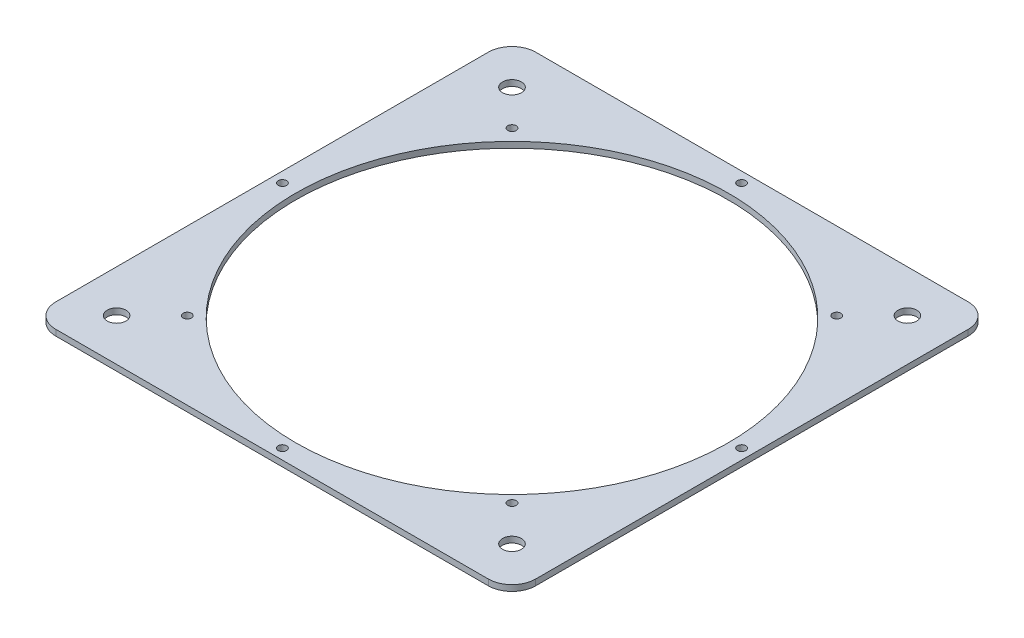
ISO-10303-21;
HEADER;
FILE_DESCRIPTION(('STEP AP214'),'2;1');
FILE_NAME('part.step','',(''),(''),'','','');
FILE_SCHEMA(('AUTOMOTIVE_DESIGN { 1 0 10303 214 1 1 1 1 }'));
ENDSEC;
DATA;
#1=APPLICATION_CONTEXT('core data for automotive mechanical design processes');
#2=APPLICATION_PROTOCOL_DEFINITION('international standard','automotive_design',2000,#1);
#3=PRODUCT_CONTEXT('',#1,'mechanical');
#4=PRODUCT('Part','Part','',(#3));
#5=PRODUCT_RELATED_PRODUCT_CATEGORY('part','',(#4));
#6=PRODUCT_DEFINITION_FORMATION('','',#4);
#7=PRODUCT_DEFINITION_CONTEXT('part definition',#1,'design');
#8=PRODUCT_DEFINITION('design','',#6,#7);
#9=PRODUCT_DEFINITION_SHAPE('','',#8);
#10=(LENGTH_UNIT() NAMED_UNIT(*) SI_UNIT(.MILLI.,.METRE.));
#11=(NAMED_UNIT(*) PLANE_ANGLE_UNIT() SI_UNIT($,.RADIAN.));
#12=(NAMED_UNIT(*) SI_UNIT($,.STERADIAN.) SOLID_ANGLE_UNIT());
#13=UNCERTAINTY_MEASURE_WITH_UNIT(LENGTH_MEASURE(1.E-05),#10,'distance_accuracy_value','');
#14=(GEOMETRIC_REPRESENTATION_CONTEXT(3) GLOBAL_UNCERTAINTY_ASSIGNED_CONTEXT((#13)) GLOBAL_UNIT_ASSIGNED_CONTEXT((#10,
#11,#12)) REPRESENTATION_CONTEXT('',''));
#15=CARTESIAN_POINT('',(0.,0.,0.));
#16=DIRECTION('',(0.,0.,1.));
#17=DIRECTION('',(1.,0.,0.));
#18=AXIS2_PLACEMENT_3D('',#15,#16,#17);
#19=CARTESIAN_POINT('',(0.,3.175,0.));
#20=DIRECTION('',(0.,-1.,0.));
#21=DIRECTION('',(0.,0.,-1.));
#22=AXIS2_PLACEMENT_3D('',#19,#20,#21);
#23=PLANE('',#22);
#24=CARTESIAN_POINT('',(-105.934238710993,3.175,105.934238710994));
#25=DIRECTION('',(0.,1.,0.));
#26=DIRECTION('',(0.,0.,1.));
#27=AXIS2_PLACEMENT_3D('',#24,#25,#26);
#28=CIRCLE('',#27,5.0419);
#29=CARTESIAN_POINT('',(-105.934238710993,3.175,110.976138710994));
#30=VERTEX_POINT('',#29);
#31=EDGE_CURVE('E248',#30,#30,#28,.T.);
#32=ORIENTED_EDGE('',*,*,#31,.F.);
#33=EDGE_LOOP('',(#32));
#34=FACE_BOUND('',#33,.T.);
#35=CARTESIAN_POINT('',(105.934238710994,3.175,105.934238710993));
#36=DIRECTION('',(0.,1.,0.));
#37=DIRECTION('',(0.,0.,1.));
#38=AXIS2_PLACEMENT_3D('',#35,#36,#37);
#39=CIRCLE('',#38,5.0419);
#40=CARTESIAN_POINT('',(105.934238710994,3.175,110.976138710993));
#41=VERTEX_POINT('',#40);
#42=EDGE_CURVE('E236',#41,#41,#39,.T.);
#43=ORIENTED_EDGE('',*,*,#42,.F.);
#44=EDGE_LOOP('',(#43));
#45=FACE_BOUND('',#44,.T.);
#46=CARTESIAN_POINT('',(-87.0007213009189,3.175,-87.0007213009169));
#47=DIRECTION('',(0.,1.,0.));
#48=DIRECTION('',(0.,0.,1.));
#49=AXIS2_PLACEMENT_3D('',#46,#47,#48);
#50=CIRCLE('',#49,2.2479);
#51=CARTESIAN_POINT('',(-87.0007213009189,3.175,-84.7528213009169));
#52=VERTEX_POINT('',#51);
#53=EDGE_CURVE('E212',#52,#52,#50,.T.);
#54=ORIENTED_EDGE('',*,*,#53,.F.);
#55=EDGE_LOOP('',(#54));
#56=FACE_BOUND('',#55,.T.);
#57=CARTESIAN_POINT('',(-123.0376,3.175,1.41553435639707E-12));
#58=DIRECTION('',(0.,1.,0.));
#59=DIRECTION('',(0.,0.,1.));
#60=AXIS2_PLACEMENT_3D('',#57,#58,#59);
#61=CIRCLE('',#60,2.2479);
#62=CARTESIAN_POINT('',(-123.0376,3.175,2.24790000000141));
#63=VERTEX_POINT('',#62);
#64=EDGE_CURVE('E206',#63,#63,#61,.T.);
#65=ORIENTED_EDGE('',*,*,#64,.F.);
#66=EDGE_LOOP('',(#65));
#67=FACE_BOUND('',#66,.T.);
#68=CARTESIAN_POINT('',(-87.0007213009169,3.175,87.000721300919));
#69=DIRECTION('',(0.,1.,0.));
#70=DIRECTION('',(0.,0.,1.));
#71=AXIS2_PLACEMENT_3D('',#68,#69,#70);
#72=CIRCLE('',#71,2.2479);
#73=CARTESIAN_POINT('',(-87.0007213009169,3.175,89.248621300919));
#74=VERTEX_POINT('',#73);
#75=EDGE_CURVE('E200',#74,#74,#72,.T.);
#76=ORIENTED_EDGE('',*,*,#75,.F.);
#77=EDGE_LOOP('',(#76));
#78=FACE_BOUND('',#77,.T.);
#79=CARTESIAN_POINT('',(1.47319645584039E-12,3.175,123.0376));
#80=DIRECTION('',(0.,1.,0.));
#81=DIRECTION('',(0.,0.,1.));
#82=AXIS2_PLACEMENT_3D('',#79,#80,#81);
#83=CIRCLE('',#82,2.2479);
#84=CARTESIAN_POINT('',(1.47319645584039E-12,3.175,125.2855));
#85=VERTEX_POINT('',#84);
#86=EDGE_CURVE('E194',#85,#85,#83,.T.);
#87=ORIENTED_EDGE('',*,*,#86,.F.);
#88=EDGE_LOOP('',(#87));
#89=FACE_BOUND('',#88,.T.);
#90=CARTESIAN_POINT('',(87.0007213009189,3.175,87.0007213009169));
#91=DIRECTION('',(0.,1.,0.));
#92=DIRECTION('',(0.,0.,1.));
#93=AXIS2_PLACEMENT_3D('',#90,#91,#92);
#94=CIRCLE('',#93,2.2479);
#95=CARTESIAN_POINT('',(87.0007213009189,3.175,89.2486213009169));
#96=VERTEX_POINT('',#95);
#97=EDGE_CURVE('E188',#96,#96,#94,.T.);
#98=ORIENTED_EDGE('',*,*,#97,.F.);
#99=EDGE_LOOP('',(#98));
#100=FACE_BOUND('',#99,.T.);
#101=CARTESIAN_POINT('',(1.09639963687858,3.175,1.09639963687858));
#102=DIRECTION('',(0.,1.,0.));
#103=DIRECTION('',(0.,0.,1.));
#104=AXIS2_PLACEMENT_3D('',#101,#102,#103);
#105=CIRCLE('',#104,115.8875);
#106=CARTESIAN_POINT('',(1.09639963687858,3.175,116.983899636879));
#107=VERTEX_POINT('',#106);
#108=EDGE_CURVE('E177',#107,#107,#105,.T.);
#109=ORIENTED_EDGE('',*,*,#108,.F.);
#110=EDGE_LOOP('',(#109));
#111=FACE_BOUND('',#110,.T.);
#112=DIRECTION('',(-1.,0.,0.));
#113=VECTOR('',#112,1.);
#114=CARTESIAN_POINT('',(-128.5875,3.175,-128.5875));
#115=LINE('',#114,#113);
#116=CARTESIAN_POINT('',(115.8875,3.175,-128.5875));
#117=VERTEX_POINT('',#116);
#118=CARTESIAN_POINT('',(-115.8875,3.175,-128.5875));
#119=VERTEX_POINT('',#118);
#120=EDGE_CURVE('E170',#117,#119,#115,.T.);
#121=ORIENTED_EDGE('',*,*,#120,.T.);
#122=CARTESIAN_POINT('',(-115.8875,3.175,-115.8875));
#123=DIRECTION('',(0.,-1.,0.));
#124=DIRECTION('',(0.,0.,-1.));
#125=AXIS2_PLACEMENT_3D('',#122,#123,#124);
#126=CIRCLE('',#125,12.7);
#127=CARTESIAN_POINT('',(-128.5875,3.175,-115.8875));
#128=VERTEX_POINT('',#127);
#129=EDGE_CURVE('E151',#119,#128,#126,.F.);
#130=ORIENTED_EDGE('',*,*,#129,.T.);
#131=DIRECTION('',(0.,0.,1.));
#132=VECTOR('',#131,1.);
#133=CARTESIAN_POINT('',(-128.5875,3.175,128.5875));
#134=LINE('',#133,#132);
#135=CARTESIAN_POINT('',(-128.5875,3.175,115.8875));
#136=VERTEX_POINT('',#135);
#137=EDGE_CURVE('E122',#128,#136,#134,.T.);
#138=ORIENTED_EDGE('',*,*,#137,.T.);
#139=CARTESIAN_POINT('',(-115.8875,3.175,115.8875));
#140=DIRECTION('',(0.,-1.,0.));
#141=DIRECTION('',(0.,0.,-1.));
#142=AXIS2_PLACEMENT_3D('',#139,#140,#141);
#143=CIRCLE('',#142,12.7);
#144=CARTESIAN_POINT('',(-115.8875,3.175,128.5875));
#145=VERTEX_POINT('',#144);
#146=EDGE_CURVE('E58',#136,#145,#143,.F.);
#147=ORIENTED_EDGE('',*,*,#146,.T.);
#148=DIRECTION('',(1.,0.,0.));
#149=VECTOR('',#148,1.);
#150=CARTESIAN_POINT('',(-128.5875,3.175,128.5875));
#151=LINE('',#150,#149);
#152=CARTESIAN_POINT('',(115.8875,3.175,128.5875));
#153=VERTEX_POINT('',#152);
#154=EDGE_CURVE('E137',#145,#153,#151,.T.);
#155=ORIENTED_EDGE('',*,*,#154,.T.);
#156=CARTESIAN_POINT('',(115.8875,3.175,115.8875));
#157=DIRECTION('',(0.,-1.,0.));
#158=DIRECTION('',(0.,0.,-1.));
#159=AXIS2_PLACEMENT_3D('',#156,#157,#158);
#160=CIRCLE('',#159,12.7);
#161=CARTESIAN_POINT('',(128.5875,3.175,115.8875));
#162=VERTEX_POINT('',#161);
#163=EDGE_CURVE('E148',#153,#162,#160,.F.);
#164=ORIENTED_EDGE('',*,*,#163,.T.);
#165=DIRECTION('',(0.,0.,-1.));
#166=VECTOR('',#165,1.);
#167=CARTESIAN_POINT('',(128.5875,3.175,128.5875));
#168=LINE('',#167,#166);
#169=CARTESIAN_POINT('',(128.5875,3.175,-115.8875));
#170=VERTEX_POINT('',#169);
#171=EDGE_CURVE('E131',#162,#170,#168,.T.);
#172=ORIENTED_EDGE('',*,*,#171,.T.);
#173=CARTESIAN_POINT('',(115.8875,3.175,-115.8875));
#174=DIRECTION('',(0.,-1.,0.));
#175=DIRECTION('',(0.,0.,-1.));
#176=AXIS2_PLACEMENT_3D('',#173,#174,#175);
#177=CIRCLE('',#176,12.7);
#178=EDGE_CURVE('E146',#170,#117,#177,.F.);
#179=ORIENTED_EDGE('',*,*,#178,.T.);
#180=EDGE_LOOP('',(#121,#130,#138,#147,#155,#164,#172,#179));
#181=FACE_BOUND('',#180,.T.);
#182=CARTESIAN_POINT('',(-1.42941214420489E-12,3.175,-123.0376));
#183=DIRECTION('',(0.,1.,0.));
#184=DIRECTION('',(0.,0.,1.));
#185=AXIS2_PLACEMENT_3D('',#182,#183,#184);
#186=CIRCLE('',#185,2.2479);
#187=CARTESIAN_POINT('',(-1.42941214420489E-12,3.175,-120.7897));
#188=VERTEX_POINT('',#187);
#189=EDGE_CURVE('E218',#188,#188,#186,.T.);
#190=ORIENTED_EDGE('',*,*,#189,.F.);
#191=EDGE_LOOP('',(#190));
#192=FACE_BOUND('',#191,.T.);
#193=CARTESIAN_POINT('',(87.0007213009169,3.175,-87.0007213009189));
#194=DIRECTION('',(0.,1.,0.));
#195=DIRECTION('',(0.,0.,1.));
#196=AXIS2_PLACEMENT_3D('',#193,#194,#195);
#197=CIRCLE('',#196,2.2479);
#198=CARTESIAN_POINT('',(87.0007213009169,3.175,-84.7528213009189));
#199=VERTEX_POINT('',#198);
#200=EDGE_CURVE('E224',#199,#199,#197,.T.);
#201=ORIENTED_EDGE('',*,*,#200,.F.);
#202=EDGE_LOOP('',(#201));
#203=FACE_BOUND('',#202,.T.);
#204=CARTESIAN_POINT('',(123.0376,3.175,-1.4432899320127E-12));
#205=DIRECTION('',(0.,1.,0.));
#206=DIRECTION('',(0.,0.,1.));
#207=AXIS2_PLACEMENT_3D('',#204,#205,#206);
#208=CIRCLE('',#207,2.2479);
#209=CARTESIAN_POINT('',(123.0376,3.175,2.24789999999855));
#210=VERTEX_POINT('',#209);
#211=EDGE_CURVE('E230',#210,#210,#208,.T.);
#212=ORIENTED_EDGE('',*,*,#211,.F.);
#213=EDGE_LOOP('',(#212));
#214=FACE_BOUND('',#213,.T.);
#215=CARTESIAN_POINT('',(-105.934238710994,3.175,-105.934238710993));
#216=DIRECTION('',(0.,1.,0.));
#217=DIRECTION('',(0.,0.,1.));
#218=AXIS2_PLACEMENT_3D('',#215,#216,#217);
#219=CIRCLE('',#218,5.0419);
#220=CARTESIAN_POINT('',(-105.934238710994,3.175,-100.892338710993));
#221=VERTEX_POINT('',#220);
#222=EDGE_CURVE('E242',#221,#221,#219,.T.);
#223=ORIENTED_EDGE('',*,*,#222,.F.);
#224=EDGE_LOOP('',(#223));
#225=FACE_BOUND('',#224,.T.);
#226=CARTESIAN_POINT('',(105.934238710993,3.175,-105.934238710994));
#227=DIRECTION('',(0.,1.,0.));
#228=DIRECTION('',(0.,0.,1.));
#229=AXIS2_PLACEMENT_3D('',#226,#227,#228);
#230=CIRCLE('',#229,5.0419);
#231=CARTESIAN_POINT('',(105.934238710993,3.175,-100.892338710994));
#232=VERTEX_POINT('',#231);
#233=EDGE_CURVE('E254',#232,#232,#230,.T.);
#234=ORIENTED_EDGE('',*,*,#233,.F.);
#235=EDGE_LOOP('',(#234));
#236=FACE_BOUND('',#235,.T.);
#237=ADVANCED_FACE('F36',(#34,#45,#56,#67,#78,#89,#100,#111,#181,#192,#203,#214,#225,#236),#23,.F.);
#238=CARTESIAN_POINT('',(128.5875,3.175,128.5875));
#239=DIRECTION('',(-1.,0.,0.));
#240=DIRECTION('',(0.,0.,1.));
#241=AXIS2_PLACEMENT_3D('',#238,#239,#240);
#242=PLANE('',#241);
#243=ORIENTED_EDGE('',*,*,#171,.F.);
#244=DIRECTION('',(0.,-1.,0.));
#245=VECTOR('',#244,1.);
#246=CARTESIAN_POINT('',(128.5875,3.175,115.8875));
#247=LINE('',#246,#245);
#248=CARTESIAN_POINT('',(128.5875,0.,115.8875));
#249=VERTEX_POINT('',#248);
#250=EDGE_CURVE('E11',#162,#249,#247,.T.);
#251=ORIENTED_EDGE('',*,*,#250,.T.);
#252=DIRECTION('',(0.,0.,-1.));
#253=VECTOR('',#252,1.);
#254=CARTESIAN_POINT('',(128.5875,0.,128.5875));
#255=LINE('',#254,#253);
#256=CARTESIAN_POINT('',(128.5875,0.,-115.8875));
#257=VERTEX_POINT('',#256);
#258=EDGE_CURVE('E133',#249,#257,#255,.T.);
#259=ORIENTED_EDGE('',*,*,#258,.T.);
#260=DIRECTION('',(0.,-1.,0.));
#261=VECTOR('',#260,1.);
#262=CARTESIAN_POINT('',(128.5875,3.175,-115.8875));
#263=LINE('',#262,#261);
#264=EDGE_CURVE('E44',#257,#170,#263,.F.);
#265=ORIENTED_EDGE('',*,*,#264,.T.);
#266=EDGE_LOOP('',(#243,#251,#259,#265));
#267=FACE_BOUND('',#266,.T.);
#268=ADVANCED_FACE('F161',(#267),#242,.F.);
#269=CARTESIAN_POINT('',(-128.5875,3.175,-128.5875));
#270=DIRECTION('',(0.,0.,1.));
#271=DIRECTION('',(1.,0.,0.));
#272=AXIS2_PLACEMENT_3D('',#269,#270,#271);
#273=PLANE('',#272);
#274=DIRECTION('',(-1.,0.,0.));
#275=VECTOR('',#274,1.);
#276=CARTESIAN_POINT('',(-128.5875,0.,-128.5875));
#277=LINE('',#276,#275);
#278=CARTESIAN_POINT('',(115.8875,0.,-128.5875));
#279=VERTEX_POINT('',#278);
#280=CARTESIAN_POINT('',(-115.8875,0.,-128.5875));
#281=VERTEX_POINT('',#280);
#282=EDGE_CURVE('E129',#279,#281,#277,.T.);
#283=ORIENTED_EDGE('',*,*,#282,.T.);
#284=DIRECTION('',(0.,-1.,0.));
#285=VECTOR('',#284,1.);
#286=CARTESIAN_POINT('',(-115.8875,3.175,-128.5875));
#287=LINE('',#286,#285);
#288=EDGE_CURVE('E108',#281,#119,#287,.F.);
#289=ORIENTED_EDGE('',*,*,#288,.T.);
#290=ORIENTED_EDGE('',*,*,#120,.F.);
#291=DIRECTION('',(0.,-1.,0.));
#292=VECTOR('',#291,1.);
#293=CARTESIAN_POINT('',(115.8875,3.175,-128.5875));
#294=LINE('',#293,#292);
#295=EDGE_CURVE('E113',#117,#279,#294,.T.);
#296=ORIENTED_EDGE('',*,*,#295,.T.);
#297=EDGE_LOOP('',(#283,#289,#290,#296));
#298=FACE_BOUND('',#297,.T.);
#299=ADVANCED_FACE('F174',(#298),#273,.F.);
#300=CARTESIAN_POINT('',(-128.5875,3.175,128.5875));
#301=DIRECTION('',(1.,0.,0.));
#302=DIRECTION('',(0.,0.,-1.));
#303=AXIS2_PLACEMENT_3D('',#300,#301,#302);
#304=PLANE('',#303);
#305=ORIENTED_EDGE('',*,*,#137,.F.);
#306=DIRECTION('',(0.,-1.,0.));
#307=VECTOR('',#306,1.);
#308=CARTESIAN_POINT('',(-128.5875,3.175,-115.8875));
#309=LINE('',#308,#307);
#310=CARTESIAN_POINT('',(-128.5875,0.,-115.8875));
#311=VERTEX_POINT('',#310);
#312=EDGE_CURVE('E107',#128,#311,#309,.T.);
#313=ORIENTED_EDGE('',*,*,#312,.T.);
#314=DIRECTION('',(0.,0.,1.));
#315=VECTOR('',#314,1.);
#316=CARTESIAN_POINT('',(-128.5875,0.,128.5875));
#317=LINE('',#316,#315);
#318=CARTESIAN_POINT('',(-128.5875,0.,115.8875));
#319=VERTEX_POINT('',#318);
#320=EDGE_CURVE('E120',#311,#319,#317,.T.);
#321=ORIENTED_EDGE('',*,*,#320,.T.);
#322=DIRECTION('',(0.,-1.,0.));
#323=VECTOR('',#322,1.);
#324=CARTESIAN_POINT('',(-128.5875,3.175,115.8875));
#325=LINE('',#324,#323);
#326=EDGE_CURVE('E124',#319,#136,#325,.F.);
#327=ORIENTED_EDGE('',*,*,#326,.T.);
#328=EDGE_LOOP('',(#305,#313,#321,#327));
#329=FACE_BOUND('',#328,.T.);
#330=ADVANCED_FACE('F119',(#329),#304,.F.);
#331=CARTESIAN_POINT('',(-128.5875,3.175,128.5875));
#332=DIRECTION('',(0.,0.,-1.));
#333=DIRECTION('',(-1.,0.,0.));
#334=AXIS2_PLACEMENT_3D('',#331,#332,#333);
#335=PLANE('',#334);
#336=ORIENTED_EDGE('',*,*,#154,.F.);
#337=DIRECTION('',(0.,-1.,0.));
#338=VECTOR('',#337,1.);
#339=CARTESIAN_POINT('',(-115.8875,3.175,128.5875));
#340=LINE('',#339,#338);
#341=CARTESIAN_POINT('',(-115.8875,0.,128.5875));
#342=VERTEX_POINT('',#341);
#343=EDGE_CURVE('E154',#145,#342,#340,.T.);
#344=ORIENTED_EDGE('',*,*,#343,.T.);
#345=DIRECTION('',(1.,0.,0.));
#346=VECTOR('',#345,1.);
#347=CARTESIAN_POINT('',(-128.5875,0.,128.5875));
#348=LINE('',#347,#346);
#349=CARTESIAN_POINT('',(115.8875,0.,128.5875));
#350=VERTEX_POINT('',#349);
#351=EDGE_CURVE('E128',#342,#350,#348,.T.);
#352=ORIENTED_EDGE('',*,*,#351,.T.);
#353=DIRECTION('',(0.,-1.,0.));
#354=VECTOR('',#353,1.);
#355=CARTESIAN_POINT('',(115.8875,3.175,128.5875));
#356=LINE('',#355,#354);
#357=EDGE_CURVE('E51',#350,#153,#356,.F.);
#358=ORIENTED_EDGE('',*,*,#357,.T.);
#359=EDGE_LOOP('',(#336,#344,#352,#358));
#360=FACE_BOUND('',#359,.T.);
#361=ADVANCED_FACE('F276',(#360),#335,.F.);
#362=CARTESIAN_POINT('',(0.,0.,0.));
#363=DIRECTION('',(0.,-1.,0.));
#364=DIRECTION('',(0.,0.,-1.));
#365=AXIS2_PLACEMENT_3D('',#362,#363,#364);
#366=PLANE('',#365);
#367=CARTESIAN_POINT('',(105.934238710993,0.,-105.934238710994));
#368=DIRECTION('',(0.,-1.,0.));
#369=DIRECTION('',(0.,0.,-1.));
#370=AXIS2_PLACEMENT_3D('',#367,#368,#369);
#371=CIRCLE('',#370,5.0419);
#372=CARTESIAN_POINT('',(105.934238710993,0.,-110.976138710994));
#373=VERTEX_POINT('',#372);
#374=EDGE_CURVE('E251',#373,#373,#371,.T.);
#375=ORIENTED_EDGE('',*,*,#374,.F.);
#376=EDGE_LOOP('',(#375));
#377=FACE_BOUND('',#376,.T.);
#378=CARTESIAN_POINT('',(-105.934238710993,0.,105.934238710994));
#379=DIRECTION('',(0.,-1.,0.));
#380=DIRECTION('',(0.,0.,-1.));
#381=AXIS2_PLACEMENT_3D('',#378,#379,#380);
#382=CIRCLE('',#381,5.0419);
#383=CARTESIAN_POINT('',(-105.934238710993,0.,100.892338710994));
#384=VERTEX_POINT('',#383);
#385=EDGE_CURVE('E245',#384,#384,#382,.T.);
#386=ORIENTED_EDGE('',*,*,#385,.F.);
#387=EDGE_LOOP('',(#386));
#388=FACE_BOUND('',#387,.T.);
#389=CARTESIAN_POINT('',(-105.934238710994,0.,-105.934238710993));
#390=DIRECTION('',(0.,-1.,0.));
#391=DIRECTION('',(0.,0.,-1.));
#392=AXIS2_PLACEMENT_3D('',#389,#390,#391);
#393=CIRCLE('',#392,5.0419);
#394=CARTESIAN_POINT('',(-105.934238710994,0.,-110.976138710993));
#395=VERTEX_POINT('',#394);
#396=EDGE_CURVE('E239',#395,#395,#393,.T.);
#397=ORIENTED_EDGE('',*,*,#396,.F.);
#398=EDGE_LOOP('',(#397));
#399=FACE_BOUND('',#398,.T.);
#400=CARTESIAN_POINT('',(105.934238710994,0.,105.934238710993));
#401=DIRECTION('',(0.,-1.,0.));
#402=DIRECTION('',(0.,0.,-1.));
#403=AXIS2_PLACEMENT_3D('',#400,#401,#402);
#404=CIRCLE('',#403,5.0419);
#405=CARTESIAN_POINT('',(105.934238710994,0.,100.892338710993));
#406=VERTEX_POINT('',#405);
#407=EDGE_CURVE('E233',#406,#406,#404,.T.);
#408=ORIENTED_EDGE('',*,*,#407,.F.);
#409=EDGE_LOOP('',(#408));
#410=FACE_BOUND('',#409,.T.);
#411=CARTESIAN_POINT('',(123.0376,0.,-1.4432899320127E-12));
#412=DIRECTION('',(0.,-1.,0.));
#413=DIRECTION('',(0.,0.,-1.));
#414=AXIS2_PLACEMENT_3D('',#411,#412,#413);
#415=CIRCLE('',#414,2.2479);
#416=CARTESIAN_POINT('',(123.0376,0.,-2.24790000000144));
#417=VERTEX_POINT('',#416);
#418=EDGE_CURVE('E227',#417,#417,#415,.T.);
#419=ORIENTED_EDGE('',*,*,#418,.F.);
#420=EDGE_LOOP('',(#419));
#421=FACE_BOUND('',#420,.T.);
#422=CARTESIAN_POINT('',(87.0007213009169,0.,-87.0007213009189));
#423=DIRECTION('',(0.,-1.,0.));
#424=DIRECTION('',(0.,0.,-1.));
#425=AXIS2_PLACEMENT_3D('',#422,#423,#424);
#426=CIRCLE('',#425,2.2479);
#427=CARTESIAN_POINT('',(87.0007213009169,0.,-89.2486213009189));
#428=VERTEX_POINT('',#427);
#429=EDGE_CURVE('E221',#428,#428,#426,.T.);
#430=ORIENTED_EDGE('',*,*,#429,.F.);
#431=EDGE_LOOP('',(#430));
#432=FACE_BOUND('',#431,.T.);
#433=CARTESIAN_POINT('',(-1.42941214420489E-12,0.,-123.0376));
#434=DIRECTION('',(0.,-1.,0.));
#435=DIRECTION('',(0.,0.,-1.));
#436=AXIS2_PLACEMENT_3D('',#433,#434,#435);
#437=CIRCLE('',#436,2.2479);
#438=CARTESIAN_POINT('',(-1.42941214420489E-12,0.,-125.2855));
#439=VERTEX_POINT('',#438);
#440=EDGE_CURVE('E215',#439,#439,#437,.T.);
#441=ORIENTED_EDGE('',*,*,#440,.F.);
#442=EDGE_LOOP('',(#441));
#443=FACE_BOUND('',#442,.T.);
#444=CARTESIAN_POINT('',(-87.0007213009189,0.,-87.0007213009169));
#445=DIRECTION('',(0.,-1.,0.));
#446=DIRECTION('',(0.,0.,-1.));
#447=AXIS2_PLACEMENT_3D('',#444,#445,#446);
#448=CIRCLE('',#447,2.2479);
#449=CARTESIAN_POINT('',(-87.0007213009189,0.,-89.2486213009169));
#450=VERTEX_POINT('',#449);
#451=EDGE_CURVE('E209',#450,#450,#448,.T.);
#452=ORIENTED_EDGE('',*,*,#451,.F.);
#453=EDGE_LOOP('',(#452));
#454=FACE_BOUND('',#453,.T.);
#455=CARTESIAN_POINT('',(-123.0376,0.,1.41553435639707E-12));
#456=DIRECTION('',(0.,-1.,0.));
#457=DIRECTION('',(0.,0.,-1.));
#458=AXIS2_PLACEMENT_3D('',#455,#456,#457);
#459=CIRCLE('',#458,2.2479);
#460=CARTESIAN_POINT('',(-123.0376,0.,-2.24789999999858));
#461=VERTEX_POINT('',#460);
#462=EDGE_CURVE('E203',#461,#461,#459,.T.);
#463=ORIENTED_EDGE('',*,*,#462,.F.);
#464=EDGE_LOOP('',(#463));
#465=FACE_BOUND('',#464,.T.);
#466=CARTESIAN_POINT('',(-87.0007213009169,0.,87.000721300919));
#467=DIRECTION('',(0.,-1.,0.));
#468=DIRECTION('',(0.,0.,-1.));
#469=AXIS2_PLACEMENT_3D('',#466,#467,#468);
#470=CIRCLE('',#469,2.2479);
#471=CARTESIAN_POINT('',(-87.0007213009169,0.,84.752821300919));
#472=VERTEX_POINT('',#471);
#473=EDGE_CURVE('E197',#472,#472,#470,.T.);
#474=ORIENTED_EDGE('',*,*,#473,.F.);
#475=EDGE_LOOP('',(#474));
#476=FACE_BOUND('',#475,.T.);
#477=CARTESIAN_POINT('',(1.47319645584039E-12,0.,123.0376));
#478=DIRECTION('',(0.,-1.,0.));
#479=DIRECTION('',(0.,0.,-1.));
#480=AXIS2_PLACEMENT_3D('',#477,#478,#479);
#481=CIRCLE('',#480,2.2479);
#482=CARTESIAN_POINT('',(1.47319645584039E-12,0.,120.7897));
#483=VERTEX_POINT('',#482);
#484=EDGE_CURVE('E191',#483,#483,#481,.T.);
#485=ORIENTED_EDGE('',*,*,#484,.F.);
#486=EDGE_LOOP('',(#485));
#487=FACE_BOUND('',#486,.T.);
#488=CARTESIAN_POINT('',(87.0007213009189,0.,87.0007213009169));
#489=DIRECTION('',(0.,-1.,0.));
#490=DIRECTION('',(0.,0.,-1.));
#491=AXIS2_PLACEMENT_3D('',#488,#489,#490);
#492=CIRCLE('',#491,2.2479);
#493=CARTESIAN_POINT('',(87.0007213009189,0.,84.7528213009169));
#494=VERTEX_POINT('',#493);
#495=EDGE_CURVE('E184',#494,#494,#492,.T.);
#496=ORIENTED_EDGE('',*,*,#495,.F.);
#497=EDGE_LOOP('',(#496));
#498=FACE_BOUND('',#497,.T.);
#499=CARTESIAN_POINT('',(1.09639963687858,0.,1.09639963687858));
#500=DIRECTION('',(0.,1.,0.));
#501=DIRECTION('',(0.,0.,1.));
#502=AXIS2_PLACEMENT_3D('',#499,#500,#501);
#503=CIRCLE('',#502,115.8875);
#504=CARTESIAN_POINT('',(1.09639963687858,0.,116.983899636879));
#505=VERTEX_POINT('',#504);
#506=EDGE_CURVE('E175',#505,#505,#503,.T.);
#507=ORIENTED_EDGE('',*,*,#506,.T.);
#508=EDGE_LOOP('',(#507));
#509=FACE_BOUND('',#508,.T.);
#510=ORIENTED_EDGE('',*,*,#320,.F.);
#511=CARTESIAN_POINT('',(-115.8875,0.,-115.8875));
#512=DIRECTION('',(0.,-1.,0.));
#513=DIRECTION('',(0.,0.,-1.));
#514=AXIS2_PLACEMENT_3D('',#511,#512,#513);
#515=CIRCLE('',#514,12.7);
#516=EDGE_CURVE('E103',#311,#281,#515,.T.);
#517=ORIENTED_EDGE('',*,*,#516,.T.);
#518=ORIENTED_EDGE('',*,*,#282,.F.);
#519=CARTESIAN_POINT('',(115.8875,0.,-115.8875));
#520=DIRECTION('',(0.,-1.,0.));
#521=DIRECTION('',(0.,0.,-1.));
#522=AXIS2_PLACEMENT_3D('',#519,#520,#521);
#523=CIRCLE('',#522,12.7);
#524=EDGE_CURVE('E123',#279,#257,#523,.T.);
#525=ORIENTED_EDGE('',*,*,#524,.T.);
#526=ORIENTED_EDGE('',*,*,#258,.F.);
#527=CARTESIAN_POINT('',(115.8875,0.,115.8875));
#528=DIRECTION('',(0.,-1.,0.));
#529=DIRECTION('',(0.,0.,-1.));
#530=AXIS2_PLACEMENT_3D('',#527,#528,#529);
#531=CIRCLE('',#530,12.7);
#532=EDGE_CURVE('E140',#249,#350,#531,.T.);
#533=ORIENTED_EDGE('',*,*,#532,.T.);
#534=ORIENTED_EDGE('',*,*,#351,.F.);
#535=CARTESIAN_POINT('',(-115.8875,0.,115.8875));
#536=DIRECTION('',(0.,-1.,0.));
#537=DIRECTION('',(0.,0.,-1.));
#538=AXIS2_PLACEMENT_3D('',#535,#536,#537);
#539=CIRCLE('',#538,12.7);
#540=EDGE_CURVE('E114',#342,#319,#539,.T.);
#541=ORIENTED_EDGE('',*,*,#540,.T.);
#542=EDGE_LOOP('',(#510,#517,#518,#525,#526,#533,#534,#541));
#543=FACE_BOUND('',#542,.T.);
#544=ADVANCED_FACE('F126',(#377,#388,#399,#410,#421,#432,#443,#454,#465,#476,#487,#498,#509,
#543),#366,.T.);
#545=CARTESIAN_POINT('',(1.09639963687858,0.,1.09639963687858));
#546=DIRECTION('',(0.,1.,0.));
#547=DIRECTION('',(0.,0.,1.));
#548=AXIS2_PLACEMENT_3D('',#545,#546,#547);
#549=CYLINDRICAL_SURFACE('',#548,115.8875);
#550=ORIENTED_EDGE('',*,*,#506,.F.);
#551=EDGE_LOOP('',(#550));
#552=FACE_BOUND('',#551,.T.);
#553=ORIENTED_EDGE('',*,*,#108,.T.);
#554=EDGE_LOOP('',(#553));
#555=FACE_BOUND('',#554,.T.);
#556=ADVANCED_FACE('F272',(#552,#555),#549,.F.);
#557=CARTESIAN_POINT('',(87.0007213009189,3.175,87.0007213009169));
#558=DIRECTION('',(0.,1.,0.));
#559=DIRECTION('',(0.,0.,1.));
#560=AXIS2_PLACEMENT_3D('',#557,#558,#559);
#561=CYLINDRICAL_SURFACE('',#560,2.2479);
#562=ORIENTED_EDGE('',*,*,#97,.T.);
#563=EDGE_LOOP('',(#562));
#564=FACE_BOUND('',#563,.T.);
#565=ORIENTED_EDGE('',*,*,#495,.T.);
#566=EDGE_LOOP('',(#565));
#567=FACE_BOUND('',#566,.T.);
#568=ADVANCED_FACE('F337',(#564,#567),#561,.F.);
#569=CARTESIAN_POINT('',(1.47319645584039E-12,3.175,123.0376));
#570=DIRECTION('',(0.,1.,0.));
#571=DIRECTION('',(0.,0.,1.));
#572=AXIS2_PLACEMENT_3D('',#569,#570,#571);
#573=CYLINDRICAL_SURFACE('',#572,2.2479);
#574=ORIENTED_EDGE('',*,*,#86,.T.);
#575=EDGE_LOOP('',(#574));
#576=FACE_BOUND('',#575,.T.);
#577=ORIENTED_EDGE('',*,*,#484,.T.);
#578=EDGE_LOOP('',(#577));
#579=FACE_BOUND('',#578,.T.);
#580=ADVANCED_FACE('F334',(#576,#579),#573,.F.);
#581=CARTESIAN_POINT('',(-87.0007213009169,3.175,87.000721300919));
#582=DIRECTION('',(0.,1.,0.));
#583=DIRECTION('',(0.,0.,1.));
#584=AXIS2_PLACEMENT_3D('',#581,#582,#583);
#585=CYLINDRICAL_SURFACE('',#584,2.2479);
#586=ORIENTED_EDGE('',*,*,#75,.T.);
#587=EDGE_LOOP('',(#586));
#588=FACE_BOUND('',#587,.T.);
#589=ORIENTED_EDGE('',*,*,#473,.T.);
#590=EDGE_LOOP('',(#589));
#591=FACE_BOUND('',#590,.T.);
#592=ADVANCED_FACE('F330',(#588,#591),#585,.F.);
#593=CARTESIAN_POINT('',(-123.0376,3.175,1.41553435639707E-12));
#594=DIRECTION('',(0.,1.,0.));
#595=DIRECTION('',(0.,0.,1.));
#596=AXIS2_PLACEMENT_3D('',#593,#594,#595);
#597=CYLINDRICAL_SURFACE('',#596,2.2479);
#598=ORIENTED_EDGE('',*,*,#64,.T.);
#599=EDGE_LOOP('',(#598));
#600=FACE_BOUND('',#599,.T.);
#601=ORIENTED_EDGE('',*,*,#462,.T.);
#602=EDGE_LOOP('',(#601));
#603=FACE_BOUND('',#602,.T.);
#604=ADVANCED_FACE('F326',(#600,#603),#597,.F.);
#605=CARTESIAN_POINT('',(-87.0007213009189,3.175,-87.0007213009169));
#606=DIRECTION('',(0.,1.,0.));
#607=DIRECTION('',(0.,0.,1.));
#608=AXIS2_PLACEMENT_3D('',#605,#606,#607);
#609=CYLINDRICAL_SURFACE('',#608,2.2479);
#610=ORIENTED_EDGE('',*,*,#53,.T.);
#611=EDGE_LOOP('',(#610));
#612=FACE_BOUND('',#611,.T.);
#613=ORIENTED_EDGE('',*,*,#451,.T.);
#614=EDGE_LOOP('',(#613));
#615=FACE_BOUND('',#614,.T.);
#616=ADVANCED_FACE('F322',(#612,#615),#609,.F.);
#617=CARTESIAN_POINT('',(-1.42941214420489E-12,3.175,-123.0376));
#618=DIRECTION('',(0.,1.,0.));
#619=DIRECTION('',(0.,0.,1.));
#620=AXIS2_PLACEMENT_3D('',#617,#618,#619);
#621=CYLINDRICAL_SURFACE('',#620,2.2479);
#622=ORIENTED_EDGE('',*,*,#189,.T.);
#623=EDGE_LOOP('',(#622));
#624=FACE_BOUND('',#623,.T.);
#625=ORIENTED_EDGE('',*,*,#440,.T.);
#626=EDGE_LOOP('',(#625));
#627=FACE_BOUND('',#626,.T.);
#628=ADVANCED_FACE('F318',(#624,#627),#621,.F.);
#629=CARTESIAN_POINT('',(87.0007213009169,3.175,-87.0007213009189));
#630=DIRECTION('',(0.,1.,0.));
#631=DIRECTION('',(0.,0.,1.));
#632=AXIS2_PLACEMENT_3D('',#629,#630,#631);
#633=CYLINDRICAL_SURFACE('',#632,2.2479);
#634=ORIENTED_EDGE('',*,*,#200,.T.);
#635=EDGE_LOOP('',(#634));
#636=FACE_BOUND('',#635,.T.);
#637=ORIENTED_EDGE('',*,*,#429,.T.);
#638=EDGE_LOOP('',(#637));
#639=FACE_BOUND('',#638,.T.);
#640=ADVANCED_FACE('F314',(#636,#639),#633,.F.);
#641=CARTESIAN_POINT('',(123.0376,3.175,-1.4432899320127E-12));
#642=DIRECTION('',(0.,1.,0.));
#643=DIRECTION('',(0.,0.,1.));
#644=AXIS2_PLACEMENT_3D('',#641,#642,#643);
#645=CYLINDRICAL_SURFACE('',#644,2.2479);
#646=ORIENTED_EDGE('',*,*,#211,.T.);
#647=EDGE_LOOP('',(#646));
#648=FACE_BOUND('',#647,.T.);
#649=ORIENTED_EDGE('',*,*,#418,.T.);
#650=EDGE_LOOP('',(#649));
#651=FACE_BOUND('',#650,.T.);
#652=ADVANCED_FACE('F287',(#648,#651),#645,.F.);
#653=CARTESIAN_POINT('',(-115.8875,3.175,-115.8875));
#654=DIRECTION('',(0.,-1.,0.));
#655=DIRECTION('',(0.,0.,-1.));
#656=AXIS2_PLACEMENT_3D('',#653,#654,#655);
#657=CYLINDRICAL_SURFACE('',#656,12.7);
#658=ORIENTED_EDGE('',*,*,#129,.F.);
#659=ORIENTED_EDGE('',*,*,#288,.F.);
#660=ORIENTED_EDGE('',*,*,#516,.F.);
#661=ORIENTED_EDGE('',*,*,#312,.F.);
#662=EDGE_LOOP('',(#658,#659,#660,#661));
#663=FACE_BOUND('',#662,.T.);
#664=ADVANCED_FACE('F106',(#663),#657,.T.);
#665=CARTESIAN_POINT('',(-115.8875,3.175,115.8875));
#666=DIRECTION('',(0.,-1.,0.));
#667=DIRECTION('',(0.,0.,-1.));
#668=AXIS2_PLACEMENT_3D('',#665,#666,#667);
#669=CYLINDRICAL_SURFACE('',#668,12.7);
#670=ORIENTED_EDGE('',*,*,#146,.F.);
#671=ORIENTED_EDGE('',*,*,#326,.F.);
#672=ORIENTED_EDGE('',*,*,#540,.F.);
#673=ORIENTED_EDGE('',*,*,#343,.F.);
#674=EDGE_LOOP('',(#670,#671,#672,#673));
#675=FACE_BOUND('',#674,.T.);
#676=ADVANCED_FACE('F286',(#675),#669,.T.);
#677=CARTESIAN_POINT('',(115.8875,3.175,115.8875));
#678=DIRECTION('',(0.,-1.,0.));
#679=DIRECTION('',(0.,0.,-1.));
#680=AXIS2_PLACEMENT_3D('',#677,#678,#679);
#681=CYLINDRICAL_SURFACE('',#680,12.7);
#682=ORIENTED_EDGE('',*,*,#163,.F.);
#683=ORIENTED_EDGE('',*,*,#357,.F.);
#684=ORIENTED_EDGE('',*,*,#532,.F.);
#685=ORIENTED_EDGE('',*,*,#250,.F.);
#686=EDGE_LOOP('',(#682,#683,#684,#685));
#687=FACE_BOUND('',#686,.T.);
#688=ADVANCED_FACE('F289',(#687),#681,.T.);
#689=CARTESIAN_POINT('',(115.8875,3.175,-115.8875));
#690=DIRECTION('',(0.,-1.,0.));
#691=DIRECTION('',(0.,0.,-1.));
#692=AXIS2_PLACEMENT_3D('',#689,#690,#691);
#693=CYLINDRICAL_SURFACE('',#692,12.7);
#694=ORIENTED_EDGE('',*,*,#178,.F.);
#695=ORIENTED_EDGE('',*,*,#264,.F.);
#696=ORIENTED_EDGE('',*,*,#524,.F.);
#697=ORIENTED_EDGE('',*,*,#295,.F.);
#698=EDGE_LOOP('',(#694,#695,#696,#697));
#699=FACE_BOUND('',#698,.T.);
#700=ADVANCED_FACE('F38',(#699),#693,.T.);
#701=CARTESIAN_POINT('',(105.934238710994,3.175,105.934238710993));
#702=DIRECTION('',(0.,1.,0.));
#703=DIRECTION('',(0.,0.,1.));
#704=AXIS2_PLACEMENT_3D('',#701,#702,#703);
#705=CYLINDRICAL_SURFACE('',#704,5.0419);
#706=ORIENTED_EDGE('',*,*,#42,.T.);
#707=EDGE_LOOP('',(#706));
#708=FACE_BOUND('',#707,.T.);
#709=ORIENTED_EDGE('',*,*,#407,.T.);
#710=EDGE_LOOP('',(#709));
#711=FACE_BOUND('',#710,.T.);
#712=ADVANCED_FACE('F296',(#708,#711),#705,.F.);
#713=CARTESIAN_POINT('',(-105.934238710994,3.175,-105.934238710993));
#714=DIRECTION('',(0.,1.,0.));
#715=DIRECTION('',(0.,0.,1.));
#716=AXIS2_PLACEMENT_3D('',#713,#714,#715);
#717=CYLINDRICAL_SURFACE('',#716,5.0419);
#718=ORIENTED_EDGE('',*,*,#222,.T.);
#719=EDGE_LOOP('',(#718));
#720=FACE_BOUND('',#719,.T.);
#721=ORIENTED_EDGE('',*,*,#396,.T.);
#722=EDGE_LOOP('',(#721));
#723=FACE_BOUND('',#722,.T.);
#724=ADVANCED_FACE('F300',(#720,#723),#717,.F.);
#725=CARTESIAN_POINT('',(-105.934238710993,3.175,105.934238710994));
#726=DIRECTION('',(0.,1.,0.));
#727=DIRECTION('',(0.,0.,1.));
#728=AXIS2_PLACEMENT_3D('',#725,#726,#727);
#729=CYLINDRICAL_SURFACE('',#728,5.0419);
#730=ORIENTED_EDGE('',*,*,#31,.T.);
#731=EDGE_LOOP('',(#730));
#732=FACE_BOUND('',#731,.T.);
#733=ORIENTED_EDGE('',*,*,#385,.T.);
#734=EDGE_LOOP('',(#733));
#735=FACE_BOUND('',#734,.T.);
#736=ADVANCED_FACE('F306',(#732,#735),#729,.F.);
#737=CARTESIAN_POINT('',(105.934238710993,3.175,-105.934238710994));
#738=DIRECTION('',(0.,1.,0.));
#739=DIRECTION('',(0.,0.,1.));
#740=AXIS2_PLACEMENT_3D('',#737,#738,#739);
#741=CYLINDRICAL_SURFACE('',#740,5.0419);
#742=ORIENTED_EDGE('',*,*,#233,.T.);
#743=EDGE_LOOP('',(#742));
#744=FACE_BOUND('',#743,.T.);
#745=ORIENTED_EDGE('',*,*,#374,.T.);
#746=EDGE_LOOP('',(#745));
#747=FACE_BOUND('',#746,.T.);
#748=ADVANCED_FACE('F258',(#744,#747),#741,.F.);
#749=CLOSED_SHELL('',(#237,#268,#299,#330,#361,#544,#556,#568,#580,#592,#604,#616,#628,#640,
#652,#664,#676,#688,#700,#712,#724,#736,#748));
#750=MANIFOLD_SOLID_BREP('B2',#749);
#751=ADVANCED_BREP_SHAPE_REPRESENTATION('',(#18,#750),#14);
#752=SHAPE_DEFINITION_REPRESENTATION(#9,#751);
ENDSEC;
END-ISO-10303-21;
